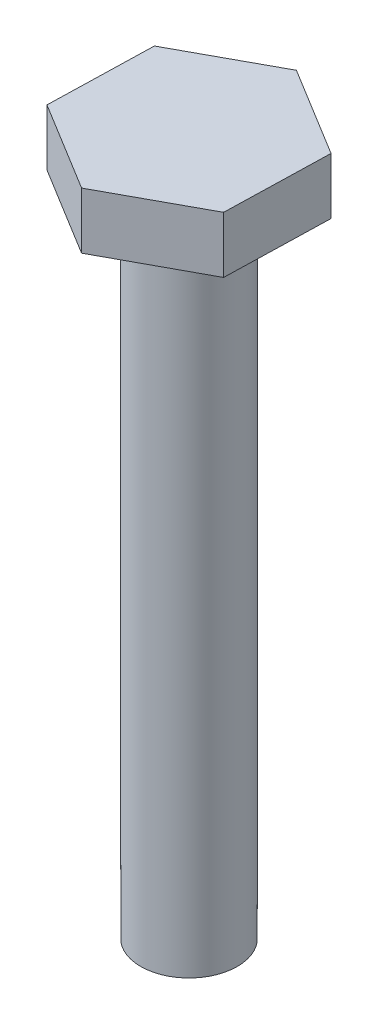
ISO-10303-21;
HEADER;
FILE_DESCRIPTION(('STEP AP214'),'2;1');
FILE_NAME('part.step','',(''),(''),'','','');
FILE_SCHEMA(('AUTOMOTIVE_DESIGN { 1 0 10303 214 1 1 1 1 }'));
ENDSEC;
DATA;
#1=APPLICATION_CONTEXT('core data for automotive mechanical design processes');
#2=APPLICATION_PROTOCOL_DEFINITION('international standard','automotive_design',2000,#1);
#3=PRODUCT_CONTEXT('',#1,'mechanical');
#4=PRODUCT('Part','Part','',(#3));
#5=PRODUCT_RELATED_PRODUCT_CATEGORY('part','',(#4));
#6=PRODUCT_DEFINITION_FORMATION('','',#4);
#7=PRODUCT_DEFINITION_CONTEXT('part definition',#1,'design');
#8=PRODUCT_DEFINITION('design','',#6,#7);
#9=PRODUCT_DEFINITION_SHAPE('','',#8);
#10=(LENGTH_UNIT() NAMED_UNIT(*) SI_UNIT(.MILLI.,.METRE.));
#11=(NAMED_UNIT(*) PLANE_ANGLE_UNIT() SI_UNIT($,.RADIAN.));
#12=(NAMED_UNIT(*) SI_UNIT($,.STERADIAN.) SOLID_ANGLE_UNIT());
#13=UNCERTAINTY_MEASURE_WITH_UNIT(LENGTH_MEASURE(1.E-05),#10,'distance_accuracy_value','');
#14=(GEOMETRIC_REPRESENTATION_CONTEXT(3) GLOBAL_UNCERTAINTY_ASSIGNED_CONTEXT((#13)) GLOBAL_UNIT_ASSIGNED_CONTEXT((#10,
#11,#12)) REPRESENTATION_CONTEXT('',''));
#15=CARTESIAN_POINT('',(0.,0.,0.));
#16=DIRECTION('',(0.,0.,1.));
#17=DIRECTION('',(1.,0.,0.));
#18=AXIS2_PLACEMENT_3D('',#15,#16,#17);
#19=CARTESIAN_POINT('',(-0.167873016872767,3.5,6.49783184225368));
#20=DIRECTION('',(-0.477466711370013,0.,-0.878649838976543));
#21=DIRECTION('',(-0.878649838976543,0.,0.477466711370013));
#22=AXIS2_PLACEMENT_3D('',#19,#20,#21);
#23=PLANE('',#22);
#24=DIRECTION('',(0.878649838976543,0.,-0.477466711370013));
#25=VECTOR('',#24,1.);
#26=CARTESIAN_POINT('',(-0.167873016872767,0.,6.49783184225368));
#27=LINE('',#26,#25);
#28=CARTESIAN_POINT('',(-0.167873016872767,0.,6.49783184225368));
#29=VERTEX_POINT('',#28);
#30=CARTESIAN_POINT('',(5.54335093647476,0.,3.3942982183486));
#31=VERTEX_POINT('',#30);
#32=EDGE_CURVE('E117',#29,#31,#27,.T.);
#33=ORIENTED_EDGE('',*,*,#32,.T.);
#34=DIRECTION('',(0.,-1.,0.));
#35=VECTOR('',#34,1.);
#36=CARTESIAN_POINT('',(5.54335093647476,3.5,3.3942982183486));
#37=LINE('',#36,#35);
#38=CARTESIAN_POINT('',(5.54335093647476,3.5,3.3942982183486));
#39=VERTEX_POINT('',#38);
#40=EDGE_CURVE('E40',#39,#31,#37,.T.);
#41=ORIENTED_EDGE('',*,*,#40,.F.);
#42=DIRECTION('',(0.878649838976543,0.,-0.477466711370013));
#43=VECTOR('',#42,1.);
#44=CARTESIAN_POINT('',(-0.167873016872767,3.5,6.49783184225368));
#45=LINE('',#44,#43);
#46=CARTESIAN_POINT('',(-0.167873016872767,3.5,6.49783184225368));
#47=VERTEX_POINT('',#46);
#48=EDGE_CURVE('E128',#47,#39,#45,.T.);
#49=ORIENTED_EDGE('',*,*,#48,.F.);
#50=DIRECTION('',(0.,-1.,0.));
#51=VECTOR('',#50,1.);
#52=CARTESIAN_POINT('',(-0.167873016872767,3.5,6.49783184225368));
#53=LINE('',#52,#51);
#54=EDGE_CURVE('E113',#47,#29,#53,.T.);
#55=ORIENTED_EDGE('',*,*,#54,.T.);
#56=EDGE_LOOP('',(#33,#41,#49,#55));
#57=FACE_BOUND('',#56,.T.);
#58=ADVANCED_FACE('F32',(#57),#23,.F.);
#59=CARTESIAN_POINT('',(5.54335093647476,3.5,3.3942982183486));
#60=DIRECTION('',(-0.999666437269799,0.,-0.0258266179804261));
#61=DIRECTION('',(-0.0258266179804261,0.,0.999666437269799));
#62=AXIS2_PLACEMENT_3D('',#59,#60,#61);
#63=PLANE('',#62);
#64=DIRECTION('',(0.0258266179804261,0.,-0.999666437269799));
#65=VECTOR('',#64,1.);
#66=CARTESIAN_POINT('',(5.54335093647476,0.,3.3942982183486));
#67=LINE('',#66,#65);
#68=CARTESIAN_POINT('',(5.71122395334753,0.,-3.10353362390509));
#69=VERTEX_POINT('',#68);
#70=EDGE_CURVE('E120',#31,#69,#67,.T.);
#71=ORIENTED_EDGE('',*,*,#70,.T.);
#72=DIRECTION('',(0.,-1.,0.));
#73=VECTOR('',#72,1.);
#74=CARTESIAN_POINT('',(5.71122395334753,3.5,-3.10353362390509));
#75=LINE('',#74,#73);
#76=CARTESIAN_POINT('',(5.71122395334753,3.5,-3.10353362390509));
#77=VERTEX_POINT('',#76);
#78=EDGE_CURVE('E132',#77,#69,#75,.T.);
#79=ORIENTED_EDGE('',*,*,#78,.F.);
#80=DIRECTION('',(0.0258266179804261,0.,-0.999666437269799));
#81=VECTOR('',#80,1.);
#82=CARTESIAN_POINT('',(5.54335093647476,3.5,3.3942982183486));
#83=LINE('',#82,#81);
#84=EDGE_CURVE('E86',#39,#77,#83,.T.);
#85=ORIENTED_EDGE('',*,*,#84,.F.);
#86=ORIENTED_EDGE('',*,*,#40,.T.);
#87=EDGE_LOOP('',(#71,#79,#85,#86));
#88=FACE_BOUND('',#87,.T.);
#89=ADVANCED_FACE('F135',(#88),#63,.F.);
#90=CARTESIAN_POINT('',(5.71122395334753,3.5,-3.10353362390509));
#91=DIRECTION('',(-0.522199725899786,0.,0.852823220996115));
#92=DIRECTION('',(0.852823220996115,0.,0.522199725899786));
#93=AXIS2_PLACEMENT_3D('',#90,#91,#92);
#94=PLANE('',#93);
#95=DIRECTION('',(-0.852823220996115,0.,-0.522199725899786));
#96=VECTOR('',#95,1.);
#97=CARTESIAN_POINT('',(5.71122395334753,0.,-3.10353362390509));
#98=LINE('',#97,#96);
#99=CARTESIAN_POINT('',(0.167873016872779,0.,-6.49783184225369));
#100=VERTEX_POINT('',#99);
#101=EDGE_CURVE('E123',#69,#100,#98,.T.);
#102=ORIENTED_EDGE('',*,*,#101,.T.);
#103=DIRECTION('',(0.,-1.,0.));
#104=VECTOR('',#103,1.);
#105=CARTESIAN_POINT('',(0.167873016872779,3.5,-6.49783184225369));
#106=LINE('',#105,#104);
#107=CARTESIAN_POINT('',(0.167873016872779,3.5,-6.49783184225369));
#108=VERTEX_POINT('',#107);
#109=EDGE_CURVE('E108',#108,#100,#106,.T.);
#110=ORIENTED_EDGE('',*,*,#109,.F.);
#111=DIRECTION('',(-0.852823220996115,0.,-0.522199725899786));
#112=VECTOR('',#111,1.);
#113=CARTESIAN_POINT('',(5.71122395334753,3.5,-3.10353362390509));
#114=LINE('',#113,#112);
#115=EDGE_CURVE('E99',#77,#108,#114,.T.);
#116=ORIENTED_EDGE('',*,*,#115,.F.);
#117=ORIENTED_EDGE('',*,*,#78,.T.);
#118=EDGE_LOOP('',(#102,#110,#116,#117));
#119=FACE_BOUND('',#118,.T.);
#120=ADVANCED_FACE('F143',(#119),#94,.F.);
#121=CARTESIAN_POINT('',(0.167873016872779,3.5,-6.49783184225369));
#122=DIRECTION('',(0.477466711370013,0.,0.878649838976543));
#123=DIRECTION('',(0.878649838976543,0.,-0.477466711370013));
#124=AXIS2_PLACEMENT_3D('',#121,#122,#123);
#125=PLANE('',#124);
#126=DIRECTION('',(-0.878649838976543,0.,0.477466711370013));
#127=VECTOR('',#126,1.);
#128=CARTESIAN_POINT('',(0.167873016872779,0.,-6.49783184225369));
#129=LINE('',#128,#127);
#130=CARTESIAN_POINT('',(-5.54335093647474,0.,-3.39429821834861));
#131=VERTEX_POINT('',#130);
#132=EDGE_CURVE('E107',#100,#131,#129,.T.);
#133=ORIENTED_EDGE('',*,*,#132,.T.);
#134=DIRECTION('',(0.,-1.,0.));
#135=VECTOR('',#134,1.);
#136=CARTESIAN_POINT('',(-5.54335093647474,3.5,-3.39429821834861));
#137=LINE('',#136,#135);
#138=CARTESIAN_POINT('',(-5.54335093647474,3.5,-3.39429821834861));
#139=VERTEX_POINT('',#138);
#140=EDGE_CURVE('E104',#139,#131,#137,.T.);
#141=ORIENTED_EDGE('',*,*,#140,.F.);
#142=DIRECTION('',(-0.878649838976543,0.,0.477466711370013));
#143=VECTOR('',#142,1.);
#144=CARTESIAN_POINT('',(0.167873016872779,3.5,-6.49783184225369));
#145=LINE('',#144,#143);
#146=EDGE_CURVE('E93',#108,#139,#145,.T.);
#147=ORIENTED_EDGE('',*,*,#146,.F.);
#148=ORIENTED_EDGE('',*,*,#109,.T.);
#149=EDGE_LOOP('',(#133,#141,#147,#148));
#150=FACE_BOUND('',#149,.T.);
#151=ADVANCED_FACE('F105',(#150),#125,.F.);
#152=CARTESIAN_POINT('',(-5.54335093647474,3.5,-3.39429821834861));
#153=DIRECTION('',(0.999666437269799,0.,0.0258266179804277));
#154=DIRECTION('',(0.0258266179804277,0.,-0.999666437269799));
#155=AXIS2_PLACEMENT_3D('',#152,#153,#154);
#156=PLANE('',#155);
#157=DIRECTION('',(-0.0258266179804277,0.,0.999666437269799));
#158=VECTOR('',#157,1.);
#159=CARTESIAN_POINT('',(-5.54335093647474,0.,-3.39429821834861));
#160=LINE('',#159,#158);
#161=CARTESIAN_POINT('',(-5.71122395334752,0.,3.10353362390507));
#162=VERTEX_POINT('',#161);
#163=EDGE_CURVE('E71',#131,#162,#160,.T.);
#164=ORIENTED_EDGE('',*,*,#163,.T.);
#165=DIRECTION('',(0.,-1.,0.));
#166=VECTOR('',#165,1.);
#167=CARTESIAN_POINT('',(-5.71122395334752,3.5,3.10353362390507));
#168=LINE('',#167,#166);
#169=CARTESIAN_POINT('',(-5.71122395334752,3.5,3.10353362390507));
#170=VERTEX_POINT('',#169);
#171=EDGE_CURVE('E109',#170,#162,#168,.T.);
#172=ORIENTED_EDGE('',*,*,#171,.F.);
#173=DIRECTION('',(-0.0258266179804277,0.,0.999666437269799));
#174=VECTOR('',#173,1.);
#175=CARTESIAN_POINT('',(-5.54335093647474,3.5,-3.39429821834861));
#176=LINE('',#175,#174);
#177=EDGE_CURVE('E97',#139,#170,#176,.T.);
#178=ORIENTED_EDGE('',*,*,#177,.F.);
#179=ORIENTED_EDGE('',*,*,#140,.T.);
#180=EDGE_LOOP('',(#164,#172,#178,#179));
#181=FACE_BOUND('',#180,.T.);
#182=ADVANCED_FACE('F111',(#181),#156,.F.);
#183=CARTESIAN_POINT('',(-5.71122395334752,3.5,3.10353362390507));
#184=DIRECTION('',(0.522199725899786,0.,-0.852823220996115));
#185=DIRECTION('',(-0.852823220996115,0.,-0.522199725899786));
#186=AXIS2_PLACEMENT_3D('',#183,#184,#185);
#187=PLANE('',#186);
#188=DIRECTION('',(0.852823220996115,0.,0.522199725899786));
#189=VECTOR('',#188,1.);
#190=CARTESIAN_POINT('',(-5.71122395334752,0.,3.10353362390507));
#191=LINE('',#190,#189);
#192=EDGE_CURVE('E77',#162,#29,#191,.T.);
#193=ORIENTED_EDGE('',*,*,#192,.T.);
#194=ORIENTED_EDGE('',*,*,#54,.F.);
#195=DIRECTION('',(0.852823220996115,0.,0.522199725899786));
#196=VECTOR('',#195,1.);
#197=CARTESIAN_POINT('',(-5.71122395334752,3.5,3.10353362390507));
#198=LINE('',#197,#196);
#199=EDGE_CURVE('E48',#170,#47,#198,.T.);
#200=ORIENTED_EDGE('',*,*,#199,.F.);
#201=ORIENTED_EDGE('',*,*,#171,.T.);
#202=EDGE_LOOP('',(#193,#194,#200,#201));
#203=FACE_BOUND('',#202,.T.);
#204=ADVANCED_FACE('F163',(#203),#187,.F.);
#205=CARTESIAN_POINT('',(0.,3.5,0.));
#206=DIRECTION('',(0.,1.,0.));
#207=DIRECTION('',(0.,0.,1.));
#208=AXIS2_PLACEMENT_3D('',#205,#206,#207);
#209=PLANE('',#208);
#210=ORIENTED_EDGE('',*,*,#48,.T.);
#211=ORIENTED_EDGE('',*,*,#84,.T.);
#212=ORIENTED_EDGE('',*,*,#115,.T.);
#213=ORIENTED_EDGE('',*,*,#146,.T.);
#214=ORIENTED_EDGE('',*,*,#177,.T.);
#215=ORIENTED_EDGE('',*,*,#199,.T.);
#216=EDGE_LOOP('',(#210,#211,#212,#213,#214,#215));
#217=FACE_BOUND('',#216,.T.);
#218=ADVANCED_FACE('F95',(#217),#209,.T.);
#219=CARTESIAN_POINT('',(0.,0.,0.));
#220=DIRECTION('',(0.,1.,0.));
#221=DIRECTION('',(0.,0.,1.));
#222=AXIS2_PLACEMENT_3D('',#219,#220,#221);
#223=PLANE('',#222);
#224=CARTESIAN_POINT('',(0.,0.,0.));
#225=DIRECTION('',(0.,1.,0.));
#226=DIRECTION('',(0.,0.,1.));
#227=AXIS2_PLACEMENT_3D('',#224,#225,#226);
#228=CIRCLE('',#227,3.);
#229=CARTESIAN_POINT('',(0.,0.,3.));
#230=VERTEX_POINT('',#229);
#231=EDGE_CURVE('E11',#230,#230,#228,.F.);
#232=ORIENTED_EDGE('',*,*,#231,.F.);
#233=EDGE_LOOP('',(#232));
#234=FACE_BOUND('',#233,.T.);
#235=ORIENTED_EDGE('',*,*,#32,.F.);
#236=ORIENTED_EDGE('',*,*,#192,.F.);
#237=ORIENTED_EDGE('',*,*,#163,.F.);
#238=ORIENTED_EDGE('',*,*,#132,.F.);
#239=ORIENTED_EDGE('',*,*,#101,.F.);
#240=ORIENTED_EDGE('',*,*,#70,.F.);
#241=EDGE_LOOP('',(#235,#236,#237,#238,#239,#240));
#242=FACE_BOUND('',#241,.T.);
#243=ADVANCED_FACE('F140',(#234,#242),#223,.F.);
#244=CARTESIAN_POINT('',(0.,-40.,0.));
#245=DIRECTION('',(0.,1.,0.));
#246=DIRECTION('',(0.,0.,1.));
#247=AXIS2_PLACEMENT_3D('',#244,#245,#246);
#248=CYLINDRICAL_SURFACE('',#247,3.);
#249=CARTESIAN_POINT('',(0.,-40.,0.));
#250=DIRECTION('',(0.,-1.,0.));
#251=DIRECTION('',(0.,0.,-1.));
#252=AXIS2_PLACEMENT_3D('',#249,#250,#251);
#253=CIRCLE('',#252,3.);
#254=CARTESIAN_POINT('',(0.,-40.,-3.));
#255=VERTEX_POINT('',#254);
#256=EDGE_CURVE('E121',#255,#255,#253,.T.);
#257=ORIENTED_EDGE('',*,*,#256,.F.);
#258=EDGE_LOOP('',(#257));
#259=FACE_BOUND('',#258,.T.);
#260=ORIENTED_EDGE('',*,*,#231,.T.);
#261=EDGE_LOOP('',(#260));
#262=FACE_BOUND('',#261,.T.);
#263=ADVANCED_FACE('F152',(#259,#262),#248,.T.);
#264=CARTESIAN_POINT('',(0.,-40.,0.));
#265=DIRECTION('',(0.,-1.,0.));
#266=DIRECTION('',(0.,0.,-1.));
#267=AXIS2_PLACEMENT_3D('',#264,#265,#266);
#268=PLANE('',#267);
#269=ORIENTED_EDGE('',*,*,#256,.T.);
#270=EDGE_LOOP('',(#269));
#271=FACE_BOUND('',#270,.T.);
#272=ADVANCED_FACE('F150',(#271),#268,.T.);
#273=CLOSED_SHELL('',(#58,#89,#120,#151,#182,#204,#218,#243,#263,#272));
#274=MANIFOLD_SOLID_BREP('B2',#273);
#275=ADVANCED_BREP_SHAPE_REPRESENTATION('',(#18,#274),#14);
#276=SHAPE_DEFINITION_REPRESENTATION(#9,#275);
ENDSEC;
END-ISO-10303-21;
